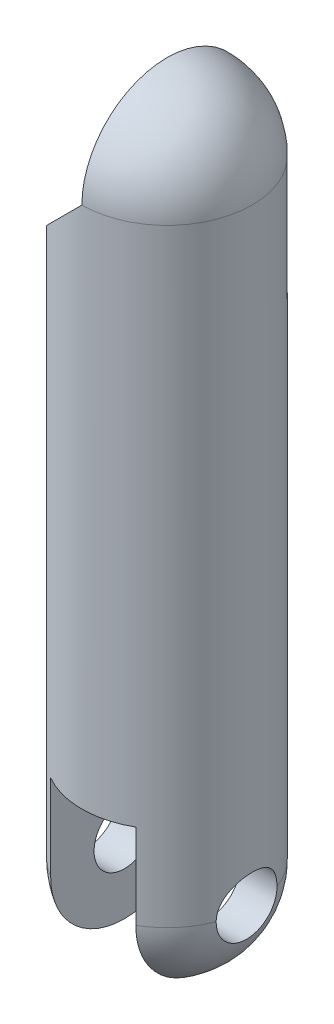
ISO-10303-21;
HEADER;
FILE_DESCRIPTION(('STEP AP214'),'2;1');
FILE_NAME('part.step','',(''),(''),'','','');
FILE_SCHEMA(('AUTOMOTIVE_DESIGN { 1 0 10303 214 1 1 1 1 }'));
ENDSEC;
DATA;
#1=APPLICATION_CONTEXT('core data for automotive mechanical design processes');
#2=APPLICATION_PROTOCOL_DEFINITION('international standard','automotive_design',2000,#1);
#3=PRODUCT_CONTEXT('',#1,'mechanical');
#4=PRODUCT('Part','Part','',(#3));
#5=PRODUCT_RELATED_PRODUCT_CATEGORY('part','',(#4));
#6=PRODUCT_DEFINITION_FORMATION('','',#4);
#7=PRODUCT_DEFINITION_CONTEXT('part definition',#1,'design');
#8=PRODUCT_DEFINITION('design','',#6,#7);
#9=PRODUCT_DEFINITION_SHAPE('','',#8);
#10=(LENGTH_UNIT() NAMED_UNIT(*) SI_UNIT(.MILLI.,.METRE.));
#11=(NAMED_UNIT(*) PLANE_ANGLE_UNIT() SI_UNIT($,.RADIAN.));
#12=(NAMED_UNIT(*) SI_UNIT($,.STERADIAN.) SOLID_ANGLE_UNIT());
#13=UNCERTAINTY_MEASURE_WITH_UNIT(LENGTH_MEASURE(1.E-05),#10,'distance_accuracy_value','');
#14=(GEOMETRIC_REPRESENTATION_CONTEXT(3) GLOBAL_UNCERTAINTY_ASSIGNED_CONTEXT((#13)) GLOBAL_UNIT_ASSIGNED_CONTEXT((#10,
#11,#12)) REPRESENTATION_CONTEXT('',''));
#15=CARTESIAN_POINT('',(0.,0.,0.));
#16=DIRECTION('',(0.,0.,1.));
#17=DIRECTION('',(1.,0.,0.));
#18=AXIS2_PLACEMENT_3D('',#15,#16,#17);
#19=CARTESIAN_POINT('',(0.,500.,0.));
#20=DIRECTION('',(0.,-1.,0.));
#21=DIRECTION('',(0.,0.,-1.));
#22=AXIS2_PLACEMENT_3D('',#19,#20,#21);
#23=CYLINDRICAL_SURFACE('',#22,70.);
#24=CARTESIAN_POINT('',(0.,500.,0.));
#25=DIRECTION('',(0.,1.,0.));
#26=DIRECTION('',(0.,0.,1.));
#27=AXIS2_PLACEMENT_3D('',#24,#25,#26);
#28=CIRCLE('',#27,70.);
#29=CARTESIAN_POINT('',(0.,500.,70.));
#30=VERTEX_POINT('',#29);
#31=CARTESIAN_POINT('',(0.,500.,-70.));
#32=VERTEX_POINT('',#31);
#33=EDGE_CURVE('E125',#30,#32,#28,.T.);
#34=ORIENTED_EDGE('',*,*,#33,.F.);
#35=CARTESIAN_POINT('',(0.,500.,0.));
#36=DIRECTION('',(0.707106781186547,-0.707106781186547,0.));
#37=DIRECTION('',(-0.707106781186547,-0.707106781186547,0.));
#38=AXIS2_PLACEMENT_3D('',#35,#36,#37);
#39=ELLIPSE('',#38,98.9949493661167,70.);
#40=EDGE_CURVE('E116',#30,#32,#39,.T.);
#41=ORIENTED_EDGE('',*,*,#40,.T.);
#42=EDGE_LOOP('',(#34,#41));
#43=FACE_BOUND('',#42,.T.);
#44=CARTESIAN_POINT('',(65.3834841531101,0.,-25.));
#45=CARTESIAN_POINT('',(65.383479435553,0.339460362905147,-25.0000017682597));
#46=CARTESIAN_POINT('',(65.386128664249,0.678879999761831,-24.9930849683774));
#47=CARTESIAN_POINT('',(65.396687711393,1.3570618316562,-24.9654472444385));
#48=CARTESIAN_POINT('',(65.4045973263122,1.69582405162135,-24.9447268544547));
#49=CARTESIAN_POINT('',(65.4361350904773,2.70994569003373,-24.8619379412415));
#50=CARTESIAN_POINT('',(65.467572255976,3.3834970210394,-24.7792416004119));
#51=CARTESIAN_POINT('',(65.5501300224332,4.71825059103688,-24.5600094100316));
#52=CARTESIAN_POINT('',(65.6011856944607,5.37948610029707,-24.4236511231752));
#53=CARTESIAN_POINT('',(65.6912853953919,6.36012322364498,-24.179793259931));
#54=CARTESIAN_POINT('',(65.7235742646132,6.68515693095704,-24.0919458142372));
#55=CARTESIAN_POINT('',(65.792412467148,7.33107530260722,-23.9033168059289));
#56=CARTESIAN_POINT('',(65.8289627823921,7.65195899169246,-23.8025322617811));
#57=CARTESIAN_POINT('',(65.9445144172925,8.60683876899676,-23.4813315914458));
#58=CARTESIAN_POINT('',(66.0294868584789,9.23381918851041,-23.24188015257));
#59=CARTESIAN_POINT('',(66.2128605616826,10.464872420855,-22.7142026753409));
#60=CARTESIAN_POINT('',(66.311262481075,11.0689441104489,-22.4259742491802));
#61=CARTESIAN_POINT('',(66.4668713113515,11.9553253975245,-21.9586420976097));
#62=CARTESIAN_POINT('',(66.5201031612315,12.2476358457334,-21.7969457284725));
#63=CARTESIAN_POINT('',(66.6288539550059,12.8251538106196,-21.4622176806676));
#64=CARTESIAN_POINT('',(66.6843722974518,13.110363163924,-21.2891889759249));
#65=CARTESIAN_POINT('',(66.8538356920829,13.9549087857853,-20.7534335114861));
#66=CARTESIAN_POINT('',(66.9706936602737,14.5031882341885,-20.3740238826489));
#67=CARTESIAN_POINT('',(67.2139631061889,15.5887137300468,-19.5568935661707));
#68=CARTESIAN_POINT('',(67.3405698363221,16.12460420261,-19.1174289468925));
#69=CARTESIAN_POINT('',(67.53167934589,16.8994200128984,-18.4263249066166));
#70=CARTESIAN_POINT('',(67.5955859097902,17.1528682331568,-18.1906254194516));
#71=CARTESIAN_POINT('',(67.7233993825141,17.6498296584778,-17.7088483854694));
#72=CARTESIAN_POINT('',(67.7873062874045,17.8933403558852,-17.462768250649));
#73=CARTESIAN_POINT('',(67.9783662318425,18.608311530629,-16.7095757674148));
#74=CARTESIAN_POINT('',(68.1048772807146,19.0642864427562,-16.1874441179225));
#75=CARTESIAN_POINT('',(68.3527981943061,19.9318312617065,-15.10637003089));
#76=CARTESIAN_POINT('',(68.4742081157714,20.3434016625721,-14.5474280030117));
#77=CARTESIAN_POINT('',(68.6518855908591,20.9312607895992,-13.6751736995018));
#78=CARTESIAN_POINT('',(68.711212914784,21.1249253943917,-13.3740707765511));
#79=CARTESIAN_POINT('',(68.8272380609203,21.4993106316292,-12.7635362906018));
#80=CARTESIAN_POINT('',(68.8839365100505,21.6800343557943,-12.4541067413952));
#81=CARTESIAN_POINT('',(69.0495113230116,22.202347858266,-11.5138887846975));
#82=CARTESIAN_POINT('',(69.1538775959558,22.5241141845203,-10.8711203175934));
#83=CARTESIAN_POINT('',(69.3474817481775,23.1116890861912,-9.55859969497567));
#84=CARTESIAN_POINT('',(69.4367237456434,23.3775128989751,-8.88885494650571));
#85=CARTESIAN_POINT('',(69.5975172710502,23.8508702522713,-7.52698572445153));
#86=CARTESIAN_POINT('',(69.6690696804387,24.0584066972319,-6.83486236790618));
#87=CARTESIAN_POINT('',(69.7899073296425,24.4060783702001,-5.46125476478845));
#88=CARTESIAN_POINT('',(69.8399600066306,24.5485506750889,-4.78042889687009));
#89=CARTESIAN_POINT('',(69.9203616802374,24.7763671455717,-3.40812909510431));
#90=CARTESIAN_POINT('',(69.9507111488977,24.8617126797879,-2.71665541675927));
#91=CARTESIAN_POINT('',(69.9908344900522,24.9743806236792,-1.32856451258334));
#92=CARTESIAN_POINT('',(70.0006131874111,25.0017166394727,-0.631948531352524));
#93=CARTESIAN_POINT('',(69.9993272368073,24.9981165480882,0.7611043208908));
#94=CARTESIAN_POINT('',(69.9882631523526,24.9671820163195,1.45754119623651));
#95=CARTESIAN_POINT('',(69.9465753211636,24.8500743395669,2.81351786260711));
#96=CARTESIAN_POINT('',(69.916854374317,24.7664501682667,3.47330747389022));
#97=CARTESIAN_POINT('',(69.83947646971,24.5471586125259,4.78308332449859));
#98=CARTESIAN_POINT('',(69.7918201487049,24.4114930756937,5.43306991100624));
#99=CARTESIAN_POINT('',(69.6797924896578,24.0893392037891,6.71885455465985));
#100=CARTESIAN_POINT('',(69.6154207632656,23.9028496879146,7.35465228178231));
#101=CARTESIAN_POINT('',(69.4715903026429,23.4806563795564,8.60790868938497));
#102=CARTESIAN_POINT('',(69.3921312009818,23.244951388489,9.2253669228105));
#103=CARTESIAN_POINT('',(69.2188693334361,22.7225314734751,10.4467097647537));
#104=CARTESIAN_POINT('',(69.1248814323734,22.4351489829313,11.0502835807593));
#105=CARTESIAN_POINT('',(68.9755661261912,21.9693033502593,11.9357040978451));
#106=CARTESIAN_POINT('',(68.9244027465998,21.8082174417512,12.2275346653192));
#107=CARTESIAN_POINT('',(68.8195961843348,21.4746803527446,12.804260286534));
#108=CARTESIAN_POINT('',(68.7659524682033,21.3022267239096,13.089153827992));
#109=CARTESIAN_POINT('',(68.6017942933786,20.7682690542202,13.9327636674263));
#110=CARTESIAN_POINT('',(68.4880461203455,20.3901475554675,14.480448441456));
#111=CARTESIAN_POINT('',(68.2547130163713,19.5921257203294,15.5431726543278));
#112=CARTESIAN_POINT('',(68.1351278408307,19.1722236323614,16.0582107230272));
#113=CARTESIAN_POINT('',(67.9503189699935,18.5012261982784,16.817459093924));
#114=CARTESIAN_POINT('',(67.8861421715085,18.2642497695951,17.0745228094649));
#115=CARTESIAN_POINT('',(67.7574215024384,17.7798394291065,17.5783794331698));
#116=CARTESIAN_POINT('',(67.692877721157,17.5324079745287,17.8251747279382));
#117=CARTESIAN_POINT('',(67.4993112309752,16.7748433769105,18.5497402211124));
#118=CARTESIAN_POINT('',(67.3703462964984,16.249414562013,19.0117188036613));
#119=CARTESIAN_POINT('',(67.1161374459986,15.1610026502746,19.8905393662289));
#120=CARTESIAN_POINT('',(66.9908949223361,14.5980057504545,20.3073646071458));
#121=CARTESIAN_POINT('',(66.7477042733918,13.4379161148371,21.0929625071064));
#122=CARTESIAN_POINT('',(66.6297559761471,12.8408241834759,21.4617362991997));
#123=CARTESIAN_POINT('',(66.4024742391587,11.6045108142792,22.1550698035902));
#124=CARTESIAN_POINT('',(66.2933474410309,10.9647039026328,22.4786546317743));
#125=CARTESIAN_POINT('',(66.0897320722169,9.65760783469404,23.0704425997747));
#126=CARTESIAN_POINT('',(65.9952452229643,8.99031545819187,23.3386392280198));
#127=CARTESIAN_POINT('',(65.8242035850011,7.63397656682949,23.8167731427208));
#128=CARTESIAN_POINT('',(65.7476238110869,6.94496190326214,24.0267916798381));
#129=CARTESIAN_POINT('',(65.6149274877259,5.54983236114411,24.3868439652249));
#130=CARTESIAN_POINT('',(65.5588016587899,4.84372539242742,24.5369049178708));
#131=CARTESIAN_POINT('',(65.4709015125375,3.44988917185718,24.7704668416985));
#132=CARTESIAN_POINT('',(65.4381955148793,2.76265027882875,24.8565203941489));
#133=CARTESIAN_POINT('',(65.4054141358544,1.72831053385608,24.9425862731783));
#134=CARTESIAN_POINT('',(65.3971999915986,1.3831240259627,24.9641057969266));
#135=CARTESIAN_POINT('',(65.3862317960732,0.691973615411442,24.9928153429872));
#136=CARTESIAN_POINT('',(65.383479254371,0.346009524277538,25.0000014035847));
#137=CARTESIAN_POINT('',(65.3834841531101,0.,25.));
#138=B_SPLINE_CURVE_WITH_KNOTS('',3,(#44,#45,#46,#47,#48,#49,#50,#51,#52,#53,#54,#55,#56,#57,
#58,#59,#60,#61,#62,#63,#64,#65,#66,#67,#68,#69,#70,#71,#72,#73,#74,#75,#76,#77,#78,#79,#80,#81,
#82,#83,#84,#85,#86,#87,#88,#89,#90,#91,#92,#93,#94,#95,#96,#97,#98,#99,#100,#101,#102,#103,
#104,#105,#106,#107,#108,#109,#110,#111,#112,#113,#114,#115,#116,#117,#118,#119,#120,#121,#122,
#123,#124,#125,#126,#127,#128,#129,#130,#131,#132,#133,#134,#135,#136,#137),.UNSPECIFIED.,.F.,
.F.,(4,2,2,2,2,2,2,2,2,2,2,2,2,2,2,2,2,2,2,2,2,2,2,2,2,2,2,2,2,2,2,2,2,2,2,2,2,2,2,2,2,2,2,2,2,
2,4),(0.,1.01821944472569,2.03639949596423,4.07169250278286,6.10030677598501,7.11476651324302,
8.12946046795771,10.1565102013426,12.1836591947549,13.1982236873783,14.2125229882676,
16.2410338846836,18.3520430596614,19.407661931956,20.4635455546441,22.5750056070069,
24.6864421649397,25.7748108422269,26.8629186225366,29.0389485300162,31.2143849710665,
33.3897129912984,35.4791779189299,37.5685927861376,39.6575175274021,41.7463857930606,
43.7412336145253,45.7360106200784,47.7308339745731,49.7257059162537,51.7484892532819,
52.7599797072087,53.7716887284503,55.7949725460606,57.8183412222948,58.8844773263389,
59.9503642369416,62.0820212549683,64.2144658290067,66.3468601110535,68.5198317367405,
70.6930586770051,72.863235040815,75.0324256157313,77.1096339827644,78.1472000452822,
79.1850528474007),.UNSPECIFIED.);
#139=CARTESIAN_POINT('',(65.3834841531101,0.,-25.));
#140=VERTEX_POINT('',#139);
#141=CARTESIAN_POINT('',(65.3834841531101,0.,25.));
#142=VERTEX_POINT('',#141);
#143=EDGE_CURVE('E56',#140,#142,#138,.T.);
#144=ORIENTED_EDGE('',*,*,#143,.F.);
#145=CARTESIAN_POINT('',(0.,0.,0.));
#146=DIRECTION('',(0.,1.,0.));
#147=DIRECTION('',(0.,0.,1.));
#148=AXIS2_PLACEMENT_3D('',#145,#146,#147);
#149=CIRCLE('',#148,70.);
#150=CARTESIAN_POINT('',(35.,0.,-60.6217782649107));
#151=VERTEX_POINT('',#150);
#152=EDGE_CURVE('E119',#140,#151,#149,.T.);
#153=ORIENTED_EDGE('',*,*,#152,.T.);
#154=DIRECTION('',(0.,-1.,0.));
#155=VECTOR('',#154,1.);
#156=CARTESIAN_POINT('',(35.,500.,-60.6217782649107));
#157=LINE('',#156,#155);
#158=CARTESIAN_POINT('',(35.,70.,-60.6217782649107));
#159=VERTEX_POINT('',#158);
#160=EDGE_CURVE('E130',#159,#151,#157,.T.);
#161=ORIENTED_EDGE('',*,*,#160,.F.);
#162=CARTESIAN_POINT('',(0.,70.,0.));
#163=DIRECTION('',(0.,-1.,0.));
#164=DIRECTION('',(0.,0.,-1.));
#165=AXIS2_PLACEMENT_3D('',#162,#163,#164);
#166=CIRCLE('',#165,70.);
#167=CARTESIAN_POINT('',(-35.,70.,-60.6217782649107));
#168=VERTEX_POINT('',#167);
#169=EDGE_CURVE('E50',#168,#159,#166,.T.);
#170=ORIENTED_EDGE('',*,*,#169,.F.);
#171=DIRECTION('',(0.,-1.,0.));
#172=VECTOR('',#171,1.);
#173=CARTESIAN_POINT('',(-35.,500.,-60.6217782649107));
#174=LINE('',#173,#172);
#175=CARTESIAN_POINT('',(-35.,0.,-60.6217782649107));
#176=VERTEX_POINT('',#175);
#177=EDGE_CURVE('E165',#176,#168,#174,.F.);
#178=ORIENTED_EDGE('',*,*,#177,.F.);
#179=CARTESIAN_POINT('',(-65.3834841531101,0.,-25.));
#180=VERTEX_POINT('',#179);
#181=EDGE_CURVE('E110',#176,#180,#149,.T.);
#182=ORIENTED_EDGE('',*,*,#181,.T.);
#183=CARTESIAN_POINT('',(-65.3834841531101,0.,25.));
#184=CARTESIAN_POINT('',(-65.383479435553,0.339460362905147,25.0000017682597));
#185=CARTESIAN_POINT('',(-65.386128664249,0.678879999761831,24.9930849683774));
#186=CARTESIAN_POINT('',(-65.396687711393,1.3570618316562,24.9654472444385));
#187=CARTESIAN_POINT('',(-65.4045973263122,1.69582405162135,24.9447268544547));
#188=CARTESIAN_POINT('',(-65.4361350904773,2.70994569003373,24.8619379412415));
#189=CARTESIAN_POINT('',(-65.467572255976,3.3834970210394,24.7792416004119));
#190=CARTESIAN_POINT('',(-65.5501300224332,4.71825059103688,24.5600094100316));
#191=CARTESIAN_POINT('',(-65.6011856944607,5.37948610029707,24.4236511231752));
#192=CARTESIAN_POINT('',(-65.6912853953919,6.36012322364498,24.179793259931));
#193=CARTESIAN_POINT('',(-65.7235742646132,6.68515693095704,24.0919458142372));
#194=CARTESIAN_POINT('',(-65.792412467148,7.33107530260722,23.9033168059289));
#195=CARTESIAN_POINT('',(-65.8289627823921,7.65195899169246,23.8025322617811));
#196=CARTESIAN_POINT('',(-65.9445144172925,8.60683876899676,23.4813315914458));
#197=CARTESIAN_POINT('',(-66.0294868584789,9.23381918851041,23.24188015257));
#198=CARTESIAN_POINT('',(-66.2128605616826,10.464872420855,22.7142026753409));
#199=CARTESIAN_POINT('',(-66.311262481075,11.0689441104489,22.4259742491802));
#200=CARTESIAN_POINT('',(-66.4668713113515,11.9553253975245,21.9586420976097));
#201=CARTESIAN_POINT('',(-66.5201031612315,12.2476358457334,21.7969457284725));
#202=CARTESIAN_POINT('',(-66.6288539550059,12.8251538106196,21.4622176806676));
#203=CARTESIAN_POINT('',(-66.6843722974518,13.110363163924,21.2891889759249));
#204=CARTESIAN_POINT('',(-66.8538356920829,13.9549087857853,20.7534335114861));
#205=CARTESIAN_POINT('',(-66.9706936602737,14.5031882341885,20.3740238826489));
#206=CARTESIAN_POINT('',(-67.2139631061889,15.5887137300468,19.5568935661707));
#207=CARTESIAN_POINT('',(-67.3405698363221,16.12460420261,19.1174289468925));
#208=CARTESIAN_POINT('',(-67.53167934589,16.8994200128984,18.4263249066166));
#209=CARTESIAN_POINT('',(-67.5955859097902,17.1528682331568,18.1906254194516));
#210=CARTESIAN_POINT('',(-67.7233993825141,17.6498296584778,17.7088483854694));
#211=CARTESIAN_POINT('',(-67.7873062874045,17.8933403558852,17.462768250649));
#212=CARTESIAN_POINT('',(-67.9783662318425,18.608311530629,16.7095757674148));
#213=CARTESIAN_POINT('',(-68.1048772807146,19.0642864427562,16.1874441179225));
#214=CARTESIAN_POINT('',(-68.3527981943061,19.9318312617065,15.10637003089));
#215=CARTESIAN_POINT('',(-68.4742081157714,20.3434016625721,14.5474280030117));
#216=CARTESIAN_POINT('',(-68.6518855908591,20.9312607895992,13.6751736995018));
#217=CARTESIAN_POINT('',(-68.711212914784,21.1249253943917,13.3740707765511));
#218=CARTESIAN_POINT('',(-68.8272380609203,21.4993106316292,12.7635362906018));
#219=CARTESIAN_POINT('',(-68.8839365100505,21.6800343557943,12.4541067413952));
#220=CARTESIAN_POINT('',(-69.0495113230116,22.202347858266,11.5138887846975));
#221=CARTESIAN_POINT('',(-69.1538775959558,22.5241141845203,10.8711203175934));
#222=CARTESIAN_POINT('',(-69.3474817481775,23.1116890861912,9.55859969497567));
#223=CARTESIAN_POINT('',(-69.4367237456434,23.3775128989751,8.88885494650571));
#224=CARTESIAN_POINT('',(-69.5975172710502,23.8508702522713,7.52698572445153));
#225=CARTESIAN_POINT('',(-69.6690696804387,24.0584066972319,6.83486236790618));
#226=CARTESIAN_POINT('',(-69.7899073296425,24.4060783702001,5.46125476478845));
#227=CARTESIAN_POINT('',(-69.8399600066306,24.5485506750889,4.78042889687009));
#228=CARTESIAN_POINT('',(-69.9203616802374,24.7763671455717,3.40812909510431));
#229=CARTESIAN_POINT('',(-69.9507111488977,24.8617126797879,2.71665541675927));
#230=CARTESIAN_POINT('',(-69.9908344900522,24.9743806236792,1.32856451258334));
#231=CARTESIAN_POINT('',(-70.0006131874111,25.0017166394727,0.631948531352524));
#232=CARTESIAN_POINT('',(-69.9993272368073,24.9981165480882,-0.7611043208908));
#233=CARTESIAN_POINT('',(-69.9882631523526,24.9671820163195,-1.45754119623651));
#234=CARTESIAN_POINT('',(-69.9465753211636,24.8500743395669,-2.81351786260711));
#235=CARTESIAN_POINT('',(-69.916854374317,24.7664501682667,-3.47330747389022));
#236=CARTESIAN_POINT('',(-69.83947646971,24.5471586125259,-4.78308332449859));
#237=CARTESIAN_POINT('',(-69.7918201487049,24.4114930756937,-5.43306991100624));
#238=CARTESIAN_POINT('',(-69.6797924896578,24.0893392037891,-6.71885455465985));
#239=CARTESIAN_POINT('',(-69.6154207632656,23.9028496879146,-7.35465228178231));
#240=CARTESIAN_POINT('',(-69.4715903026429,23.4806563795564,-8.60790868938497));
#241=CARTESIAN_POINT('',(-69.3921312009818,23.244951388489,-9.2253669228105));
#242=CARTESIAN_POINT('',(-69.2188693334361,22.7225314734751,-10.4467097647537));
#243=CARTESIAN_POINT('',(-69.1248814323734,22.4351489829313,-11.0502835807593));
#244=CARTESIAN_POINT('',(-68.9755661261912,21.9693033502593,-11.9357040978451));
#245=CARTESIAN_POINT('',(-68.9244027465998,21.8082174417512,-12.2275346653192));
#246=CARTESIAN_POINT('',(-68.8195961843348,21.4746803527446,-12.804260286534));
#247=CARTESIAN_POINT('',(-68.7659524682033,21.3022267239096,-13.089153827992));
#248=CARTESIAN_POINT('',(-68.6017942933786,20.7682690542202,-13.9327636674263));
#249=CARTESIAN_POINT('',(-68.4880461203455,20.3901475554675,-14.480448441456));
#250=CARTESIAN_POINT('',(-68.2547130163713,19.5921257203294,-15.5431726543278));
#251=CARTESIAN_POINT('',(-68.1351278408307,19.1722236323614,-16.0582107230272));
#252=CARTESIAN_POINT('',(-67.9503189699935,18.5012261982784,-16.817459093924));
#253=CARTESIAN_POINT('',(-67.8861421715085,18.2642497695951,-17.0745228094649));
#254=CARTESIAN_POINT('',(-67.7574215024384,17.7798394291065,-17.5783794331698));
#255=CARTESIAN_POINT('',(-67.692877721157,17.5324079745287,-17.8251747279382));
#256=CARTESIAN_POINT('',(-67.4993112309752,16.7748433769105,-18.5497402211124));
#257=CARTESIAN_POINT('',(-67.3703462964984,16.249414562013,-19.0117188036613));
#258=CARTESIAN_POINT('',(-67.1161374459986,15.1610026502746,-19.8905393662289));
#259=CARTESIAN_POINT('',(-66.9908949223361,14.5980057504545,-20.3073646071458));
#260=CARTESIAN_POINT('',(-66.7477042733918,13.4379161148371,-21.0929625071064));
#261=CARTESIAN_POINT('',(-66.6297559761471,12.8408241834759,-21.4617362991997));
#262=CARTESIAN_POINT('',(-66.4024742391587,11.6045108142792,-22.1550698035902));
#263=CARTESIAN_POINT('',(-66.2933474410309,10.9647039026328,-22.4786546317743));
#264=CARTESIAN_POINT('',(-66.0897320722169,9.65760783469404,-23.0704425997747));
#265=CARTESIAN_POINT('',(-65.9952452229643,8.99031545819187,-23.3386392280198));
#266=CARTESIAN_POINT('',(-65.8242035850011,7.63397656682949,-23.8167731427208));
#267=CARTESIAN_POINT('',(-65.7476238110869,6.94496190326214,-24.0267916798381));
#268=CARTESIAN_POINT('',(-65.6149274877259,5.54983236114411,-24.3868439652249));
#269=CARTESIAN_POINT('',(-65.5588016587899,4.84372539242742,-24.5369049178708));
#270=CARTESIAN_POINT('',(-65.4709015125375,3.44988917185718,-24.7704668416985));
#271=CARTESIAN_POINT('',(-65.4381955148793,2.76265027882875,-24.8565203941489));
#272=CARTESIAN_POINT('',(-65.4054141358544,1.72831053385608,-24.9425862731783));
#273=CARTESIAN_POINT('',(-65.3971999915986,1.3831240259627,-24.9641057969266));
#274=CARTESIAN_POINT('',(-65.3862317960732,0.691973615411442,-24.9928153429872));
#275=CARTESIAN_POINT('',(-65.383479254371,0.346009524277538,-25.0000014035847));
#276=CARTESIAN_POINT('',(-65.3834841531101,0.,-25.));
#277=B_SPLINE_CURVE_WITH_KNOTS('',3,(#183,#184,#185,#186,#187,#188,#189,#190,#191,#192,#193,
#194,#195,#196,#197,#198,#199,#200,#201,#202,#203,#204,#205,#206,#207,#208,#209,#210,#211,#212,
#213,#214,#215,#216,#217,#218,#219,#220,#221,#222,#223,#224,#225,#226,#227,#228,#229,#230,#231,
#232,#233,#234,#235,#236,#237,#238,#239,#240,#241,#242,#243,#244,#245,#246,#247,#248,#249,#250,
#251,#252,#253,#254,#255,#256,#257,#258,#259,#260,#261,#262,#263,#264,#265,#266,#267,#268,#269,
#270,#271,#272,#273,#274,#275,#276),.UNSPECIFIED.,.F.,.F.,(4,2,2,2,2,2,2,2,2,2,2,2,2,2,2,2,2,2,
2,2,2,2,2,2,2,2,2,2,2,2,2,2,2,2,2,2,2,2,2,2,2,2,2,2,2,2,4),(0.,1.01821944472569,
2.03639949596423,4.07169250278286,6.10030677598501,7.11476651324302,8.12946046795771,
10.1565102013426,12.1836591947549,13.1982236873783,14.2125229882676,16.2410338846836,
18.3520430596614,19.407661931956,20.4635455546441,22.5750056070069,24.6864421649397,
25.7748108422269,26.8629186225366,29.0389485300162,31.2143849710665,33.3897129912984,
35.4791779189299,37.5685927861376,39.6575175274021,41.7463857930606,43.7412336145253,
45.7360106200784,47.7308339745731,49.7257059162537,51.7484892532819,52.7599797072087,
53.7716887284503,55.7949725460606,57.8183412222948,58.8844773263389,59.9503642369416,
62.0820212549683,64.2144658290067,66.3468601110535,68.5198317367405,70.6930586770051,
72.863235040815,75.0324256157313,77.1096339827644,78.1472000452822,79.1850528474007),.UNSPECIFIED.);
#278=CARTESIAN_POINT('',(-65.3834841531101,0.,25.));
#279=VERTEX_POINT('',#278);
#280=EDGE_CURVE('E63',#279,#180,#277,.T.);
#281=ORIENTED_EDGE('',*,*,#280,.F.);
#282=CARTESIAN_POINT('',(-35.,0.,60.6217782649107));
#283=VERTEX_POINT('',#282);
#284=EDGE_CURVE('E107',#279,#283,#149,.T.);
#285=ORIENTED_EDGE('',*,*,#284,.T.);
#286=DIRECTION('',(0.,-1.,0.));
#287=VECTOR('',#286,1.);
#288=CARTESIAN_POINT('',(-35.,500.,60.6217782649107));
#289=LINE('',#288,#287);
#290=CARTESIAN_POINT('',(-35.,70.,60.6217782649107));
#291=VERTEX_POINT('',#290);
#292=EDGE_CURVE('E163',#291,#283,#289,.T.);
#293=ORIENTED_EDGE('',*,*,#292,.F.);
#294=CARTESIAN_POINT('',(35.,70.,60.6217782649107));
#295=VERTEX_POINT('',#294);
#296=EDGE_CURVE('E11',#295,#291,#166,.T.);
#297=ORIENTED_EDGE('',*,*,#296,.F.);
#298=DIRECTION('',(0.,-1.,0.));
#299=VECTOR('',#298,1.);
#300=CARTESIAN_POINT('',(35.,500.,60.6217782649107));
#301=LINE('',#300,#299);
#302=CARTESIAN_POINT('',(35.,0.,60.6217782649107));
#303=VERTEX_POINT('',#302);
#304=EDGE_CURVE('E142',#303,#295,#301,.F.);
#305=ORIENTED_EDGE('',*,*,#304,.F.);
#306=EDGE_CURVE('E118',#303,#142,#149,.T.);
#307=ORIENTED_EDGE('',*,*,#306,.T.);
#308=EDGE_LOOP('',(#144,#153,#161,#170,#178,#182,#281,#285,#293,#297,#305,#307));
#309=FACE_BOUND('',#308,.T.);
#310=ADVANCED_FACE('F41',(#43,#309),#23,.T.);
#311=CARTESIAN_POINT('',(0.,0.,0.));
#312=DIRECTION('',(0.,0.,-1.));
#313=DIRECTION('',(-1.,0.,0.));
#314=AXIS2_PLACEMENT_3D('',#311,#312,#313);
#315=SPHERICAL_SURFACE('',#314,70.);
#316=ORIENTED_EDGE('',*,*,#152,.F.);
#317=CARTESIAN_POINT('',(65.3834841531101,0.,0.));
#318=DIRECTION('',(-1.,0.,0.));
#319=DIRECTION('',(0.,0.,1.));
#320=AXIS2_PLACEMENT_3D('',#317,#318,#319);
#321=CIRCLE('',#320,25.);
#322=EDGE_CURVE('E111',#140,#142,#321,.T.);
#323=ORIENTED_EDGE('',*,*,#322,.T.);
#324=ORIENTED_EDGE('',*,*,#306,.F.);
#325=CARTESIAN_POINT('',(35.,0.,0.));
#326=DIRECTION('',(-1.,0.,0.));
#327=DIRECTION('',(0.,0.,1.));
#328=AXIS2_PLACEMENT_3D('',#325,#326,#327);
#329=CIRCLE('',#328,60.6217782649107);
#330=EDGE_CURVE('E137',#303,#151,#329,.F.);
#331=ORIENTED_EDGE('',*,*,#330,.T.);
#332=EDGE_LOOP('',(#316,#323,#324,#331));
#333=FACE_BOUND('',#332,.T.);
#334=ADVANCED_FACE('F145',(#333),#315,.T.);
#335=ORIENTED_EDGE('',*,*,#284,.F.);
#336=CARTESIAN_POINT('',(-65.3834841531101,0.,0.));
#337=DIRECTION('',(1.,0.,0.));
#338=DIRECTION('',(0.,0.,-1.));
#339=AXIS2_PLACEMENT_3D('',#336,#337,#338);
#340=CIRCLE('',#339,25.);
#341=EDGE_CURVE('E97',#279,#180,#340,.T.);
#342=ORIENTED_EDGE('',*,*,#341,.T.);
#343=ORIENTED_EDGE('',*,*,#181,.F.);
#344=CARTESIAN_POINT('',(-35.,0.,0.));
#345=DIRECTION('',(1.,0.,0.));
#346=DIRECTION('',(0.,0.,-1.));
#347=AXIS2_PLACEMENT_3D('',#344,#345,#346);
#348=CIRCLE('',#347,60.6217782649107);
#349=EDGE_CURVE('E115',#176,#283,#348,.F.);
#350=ORIENTED_EDGE('',*,*,#349,.T.);
#351=EDGE_LOOP('',(#335,#342,#343,#350));
#352=FACE_BOUND('',#351,.T.);
#353=ADVANCED_FACE('F114',(#352),#315,.T.);
#354=CARTESIAN_POINT('',(0.,500.,0.));
#355=DIRECTION('',(0.,0.,-1.));
#356=DIRECTION('',(1.,0.,0.));
#357=AXIS2_PLACEMENT_3D('',#354,#355,#356);
#358=SPHERICAL_SURFACE('',#357,70.);
#359=ORIENTED_EDGE('',*,*,#33,.T.);
#360=CARTESIAN_POINT('',(0.,500.,0.));
#361=DIRECTION('',(1.,0.,0.));
#362=DIRECTION('',(0.,0.,-1.));
#363=AXIS2_PLACEMENT_3D('',#360,#361,#362);
#364=CIRCLE('',#363,70.);
#365=EDGE_CURVE('E121',#32,#30,#364,.T.);
#366=ORIENTED_EDGE('',*,*,#365,.T.);
#367=EDGE_LOOP('',(#359,#366));
#368=FACE_BOUND('',#367,.T.);
#369=ADVANCED_FACE('F152',(#368),#358,.T.);
#370=CARTESIAN_POINT('',(-500.,500.,0.));
#371=DIRECTION('',(1.,0.,0.));
#372=DIRECTION('',(0.,0.,-1.));
#373=AXIS2_PLACEMENT_3D('',#370,#371,#372);
#374=CYLINDRICAL_SURFACE('',#373,70.);
#375=EDGE_CURVE('E141',#30,#32,#364,.T.);
#376=ORIENTED_EDGE('',*,*,#375,.T.);
#377=ORIENTED_EDGE('',*,*,#40,.F.);
#378=EDGE_LOOP('',(#376,#377));
#379=FACE_BOUND('',#378,.T.);
#380=ADVANCED_FACE('F157',(#379),#374,.F.);
#381=CARTESIAN_POINT('',(0.,500.,0.));
#382=DIRECTION('',(1.,0.,0.));
#383=DIRECTION('',(0.,0.,-1.));
#384=AXIS2_PLACEMENT_3D('',#381,#382,#383);
#385=PLANE('',#384);
#386=CARTESIAN_POINT('',(0.,500.,0.));
#387=DIRECTION('',(-1.,0.,0.));
#388=DIRECTION('',(0.,0.,1.));
#389=AXIS2_PLACEMENT_3D('',#386,#387,#388);
#390=CIRCLE('',#389,25.);
#391=CARTESIAN_POINT('',(0.,500.,25.));
#392=VERTEX_POINT('',#391);
#393=EDGE_CURVE('E195',#392,#392,#390,.T.);
#394=ORIENTED_EDGE('',*,*,#393,.F.);
#395=EDGE_LOOP('',(#394));
#396=FACE_BOUND('',#395,.T.);
#397=ORIENTED_EDGE('',*,*,#365,.F.);
#398=ORIENTED_EDGE('',*,*,#375,.F.);
#399=EDGE_LOOP('',(#397,#398));
#400=FACE_BOUND('',#399,.T.);
#401=ADVANCED_FACE('F160',(#396,#400),#385,.F.);
#402=CARTESIAN_POINT('',(0.,70.,0.));
#403=DIRECTION('',(0.,-1.,0.));
#404=DIRECTION('',(0.,0.,-1.));
#405=AXIS2_PLACEMENT_3D('',#402,#403,#404);
#406=PLANE('',#405);
#407=DIRECTION('',(0.,0.,-1.));
#408=VECTOR('',#407,1.);
#409=CARTESIAN_POINT('',(35.,70.,70.));
#410=LINE('',#409,#408);
#411=EDGE_CURVE('E140',#295,#159,#410,.T.);
#412=ORIENTED_EDGE('',*,*,#411,.F.);
#413=ORIENTED_EDGE('',*,*,#296,.T.);
#414=DIRECTION('',(0.,0.,1.));
#415=VECTOR('',#414,1.);
#416=CARTESIAN_POINT('',(-35.,70.,70.));
#417=LINE('',#416,#415);
#418=EDGE_CURVE('E167',#168,#291,#417,.T.);
#419=ORIENTED_EDGE('',*,*,#418,.F.);
#420=ORIENTED_EDGE('',*,*,#169,.T.);
#421=EDGE_LOOP('',(#412,#413,#419,#420));
#422=FACE_BOUND('',#421,.T.);
#423=ADVANCED_FACE('F185',(#422),#406,.T.);
#424=CARTESIAN_POINT('',(35.,70.,70.));
#425=DIRECTION('',(-1.,0.,0.));
#426=DIRECTION('',(0.,0.,1.));
#427=AXIS2_PLACEMENT_3D('',#424,#425,#426);
#428=PLANE('',#427);
#429=CARTESIAN_POINT('',(35.,0.,0.));
#430=DIRECTION('',(-1.,0.,0.));
#431=DIRECTION('',(0.,0.,1.));
#432=AXIS2_PLACEMENT_3D('',#429,#430,#431);
#433=CIRCLE('',#432,25.);
#434=CARTESIAN_POINT('',(35.,0.,25.));
#435=VERTEX_POINT('',#434);
#436=EDGE_CURVE('E103',#435,#435,#433,.F.);
#437=ORIENTED_EDGE('',*,*,#436,.T.);
#438=EDGE_LOOP('',(#437));
#439=FACE_BOUND('',#438,.T.);
#440=ORIENTED_EDGE('',*,*,#160,.T.);
#441=ORIENTED_EDGE('',*,*,#330,.F.);
#442=ORIENTED_EDGE('',*,*,#304,.T.);
#443=ORIENTED_EDGE('',*,*,#411,.T.);
#444=EDGE_LOOP('',(#440,#441,#442,#443));
#445=FACE_BOUND('',#444,.T.);
#446=ADVANCED_FACE('F135',(#439,#445),#428,.T.);
#447=CARTESIAN_POINT('',(-35.,70.,70.));
#448=DIRECTION('',(1.,0.,0.));
#449=DIRECTION('',(0.,0.,-1.));
#450=AXIS2_PLACEMENT_3D('',#447,#448,#449);
#451=PLANE('',#450);
#452=CARTESIAN_POINT('',(-35.,0.,0.));
#453=DIRECTION('',(1.,0.,0.));
#454=DIRECTION('',(0.,0.,-1.));
#455=AXIS2_PLACEMENT_3D('',#452,#453,#454);
#456=CIRCLE('',#455,25.);
#457=CARTESIAN_POINT('',(-35.,0.,-25.));
#458=VERTEX_POINT('',#457);
#459=EDGE_CURVE('E45',#458,#458,#456,.F.);
#460=ORIENTED_EDGE('',*,*,#459,.T.);
#461=EDGE_LOOP('',(#460));
#462=FACE_BOUND('',#461,.T.);
#463=ORIENTED_EDGE('',*,*,#292,.T.);
#464=ORIENTED_EDGE('',*,*,#349,.F.);
#465=ORIENTED_EDGE('',*,*,#177,.T.);
#466=ORIENTED_EDGE('',*,*,#418,.T.);
#467=EDGE_LOOP('',(#463,#464,#465,#466));
#468=FACE_BOUND('',#467,.T.);
#469=ADVANCED_FACE('F205',(#462,#468),#451,.T.);
#470=CARTESIAN_POINT('',(-85.,0.,0.));
#471=DIRECTION('',(1.,0.,0.));
#472=DIRECTION('',(0.,0.,-1.));
#473=AXIS2_PLACEMENT_3D('',#470,#471,#472);
#474=CYLINDRICAL_SURFACE('',#473,25.);
#475=ORIENTED_EDGE('',*,*,#459,.F.);
#476=EDGE_LOOP('',(#475));
#477=FACE_BOUND('',#476,.T.);
#478=ORIENTED_EDGE('',*,*,#280,.T.);
#479=ORIENTED_EDGE('',*,*,#341,.F.);
#480=EDGE_LOOP('',(#478,#479));
#481=FACE_BOUND('',#480,.T.);
#482=ADVANCED_FACE('F98',(#477,#481),#474,.F.);
#483=ORIENTED_EDGE('',*,*,#436,.F.);
#484=EDGE_LOOP('',(#483));
#485=FACE_BOUND('',#484,.T.);
#486=ORIENTED_EDGE('',*,*,#143,.T.);
#487=ORIENTED_EDGE('',*,*,#322,.F.);
#488=EDGE_LOOP('',(#486,#487));
#489=FACE_BOUND('',#488,.T.);
#490=ADVANCED_FACE('F177',(#485,#489),#474,.F.);
#491=CARTESIAN_POINT('',(50.,500.,0.));
#492=DIRECTION('',(-1.,0.,0.));
#493=DIRECTION('',(0.,0.,1.));
#494=AXIS2_PLACEMENT_3D('',#491,#492,#493);
#495=CYLINDRICAL_SURFACE('',#494,25.);
#496=CARTESIAN_POINT('',(50.,500.,0.));
#497=DIRECTION('',(-1.,0.,0.));
#498=DIRECTION('',(0.,0.,1.));
#499=AXIS2_PLACEMENT_3D('',#496,#497,#498);
#500=CIRCLE('',#499,25.);
#501=CARTESIAN_POINT('',(50.,500.,25.));
#502=VERTEX_POINT('',#501);
#503=EDGE_CURVE('E198',#502,#502,#500,.T.);
#504=ORIENTED_EDGE('',*,*,#503,.F.);
#505=EDGE_LOOP('',(#504));
#506=FACE_BOUND('',#505,.T.);
#507=ORIENTED_EDGE('',*,*,#393,.T.);
#508=EDGE_LOOP('',(#507));
#509=FACE_BOUND('',#508,.T.);
#510=ADVANCED_FACE('F182',(#506,#509),#495,.F.);
#511=CARTESIAN_POINT('',(50.,500.,0.));
#512=DIRECTION('',(-1.,0.,0.));
#513=DIRECTION('',(0.,0.,1.));
#514=AXIS2_PLACEMENT_3D('',#511,#512,#513);
#515=PLANE('',#514);
#516=ORIENTED_EDGE('',*,*,#503,.T.);
#517=EDGE_LOOP('',(#516));
#518=FACE_BOUND('',#517,.T.);
#519=ADVANCED_FACE('F287',(#518),#515,.T.);
#520=CLOSED_SHELL('',(#310,#334,#353,#369,#380,#401,#423,#446,#469,#482,#490,#510,#519));
#521=MANIFOLD_SOLID_BREP('B2',#520);
#522=ADVANCED_BREP_SHAPE_REPRESENTATION('',(#18,#521),#14);
#523=SHAPE_DEFINITION_REPRESENTATION(#9,#522);
ENDSEC;
END-ISO-10303-21;
